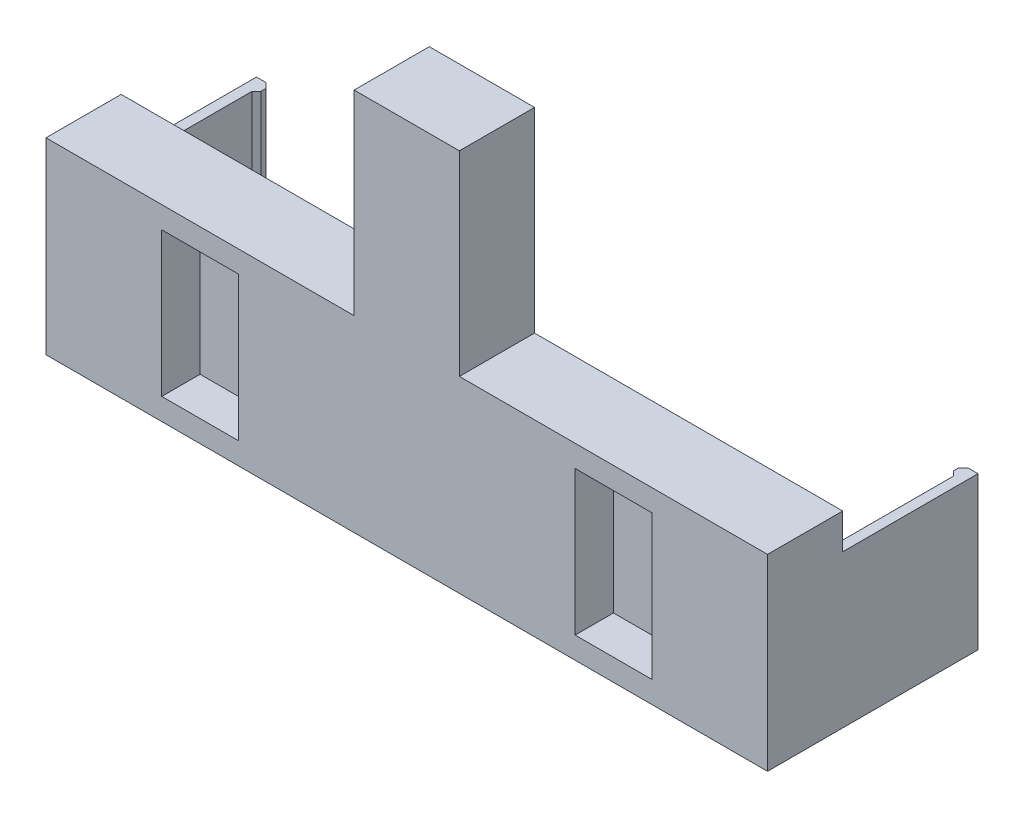
ISO-10303-21;
HEADER;
FILE_DESCRIPTION(('STEP AP214'),'2;1');
FILE_NAME('part.step','',(''),(''),'','','');
FILE_SCHEMA(('AUTOMOTIVE_DESIGN { 1 0 10303 214 1 1 1 1 }'));
ENDSEC;
DATA;
#1=APPLICATION_CONTEXT('core data for automotive mechanical design processes');
#2=APPLICATION_PROTOCOL_DEFINITION('international standard','automotive_design',2000,#1);
#3=PRODUCT_CONTEXT('',#1,'mechanical');
#4=PRODUCT('Part','Part','',(#3));
#5=PRODUCT_RELATED_PRODUCT_CATEGORY('part','',(#4));
#6=PRODUCT_DEFINITION_FORMATION('','',#4);
#7=PRODUCT_DEFINITION_CONTEXT('part definition',#1,'design');
#8=PRODUCT_DEFINITION('design','',#6,#7);
#9=PRODUCT_DEFINITION_SHAPE('','',#8);
#10=(LENGTH_UNIT() NAMED_UNIT(*) SI_UNIT(.MILLI.,.METRE.));
#11=(NAMED_UNIT(*) PLANE_ANGLE_UNIT() SI_UNIT($,.RADIAN.));
#12=(NAMED_UNIT(*) SI_UNIT($,.STERADIAN.) SOLID_ANGLE_UNIT());
#13=UNCERTAINTY_MEASURE_WITH_UNIT(LENGTH_MEASURE(1.E-05),#10,'distance_accuracy_value','');
#14=(GEOMETRIC_REPRESENTATION_CONTEXT(3) GLOBAL_UNCERTAINTY_ASSIGNED_CONTEXT((#13)) GLOBAL_UNIT_ASSIGNED_CONTEXT((#10,
#11,#12)) REPRESENTATION_CONTEXT('',''));
#15=CARTESIAN_POINT('',(0.,0.,0.));
#16=DIRECTION('',(0.,0.,1.));
#17=DIRECTION('',(1.,0.,0.));
#18=AXIS2_PLACEMENT_3D('',#15,#16,#17);
#19=CARTESIAN_POINT('',(-46.65,0.,-18.));
#20=DIRECTION('',(-1.,0.,0.));
#21=DIRECTION('',(0.,-1.,0.));
#22=AXIS2_PLACEMENT_3D('',#19,#20,#21);
#23=PLANE('',#22);
#24=DIRECTION('',(0.,0.,-1.));
#25=VECTOR('',#24,1.);
#26=CARTESIAN_POINT('',(-46.65,5.5,-18.));
#27=LINE('',#26,#25);
#28=CARTESIAN_POINT('',(-46.65,5.5,0.));
#29=VERTEX_POINT('',#28);
#30=CARTESIAN_POINT('',(-46.65,5.5,-16.062132034356));
#31=VERTEX_POINT('',#30);
#32=EDGE_CURVE('E393',#29,#31,#27,.T.);
#33=ORIENTED_EDGE('',*,*,#32,.F.);
#34=DIRECTION('',(0.,-1.,0.));
#35=VECTOR('',#34,1.);
#36=CARTESIAN_POINT('',(-46.65,0.,0.));
#37=LINE('',#36,#35);
#38=CARTESIAN_POINT('',(-46.65,-12.5,0.));
#39=VERTEX_POINT('',#38);
#40=EDGE_CURVE('E268',#29,#39,#37,.T.);
#41=ORIENTED_EDGE('',*,*,#40,.T.);
#42=DIRECTION('',(0.,0.,1.));
#43=VECTOR('',#42,1.);
#44=CARTESIAN_POINT('',(-46.65,-12.5,10.));
#45=LINE('',#44,#43);
#46=CARTESIAN_POINT('',(-46.65,-12.5,-16.062132034356));
#47=VERTEX_POINT('',#46);
#48=EDGE_CURVE('E266',#47,#39,#45,.T.);
#49=ORIENTED_EDGE('',*,*,#48,.F.);
#50=DIRECTION('',(0.,1.,0.));
#51=VECTOR('',#50,1.);
#52=CARTESIAN_POINT('',(-46.65,-14.5880613017821,-16.062132034356));
#53=LINE('',#52,#51);
#54=EDGE_CURVE('E374',#47,#31,#53,.T.);
#55=ORIENTED_EDGE('',*,*,#54,.T.);
#56=EDGE_LOOP('',(#33,#41,#49,#55));
#57=FACE_BOUND('',#56,.T.);
#58=ADVANCED_FACE('F43',(#57),#23,.F.);
#59=CARTESIAN_POINT('',(0.,12.5,10.));
#60=DIRECTION('',(0.,1.,0.));
#61=DIRECTION('',(0.,0.,1.));
#62=AXIS2_PLACEMENT_3D('',#59,#60,#61);
#63=PLANE('',#62);
#64=DIRECTION('',(1.,0.,0.));
#65=VECTOR('',#64,1.);
#66=CARTESIAN_POINT('',(0.,12.5,0.));
#67=LINE('',#66,#65);
#68=CARTESIAN_POINT('',(-48.,12.5,0.));
#69=VERTEX_POINT('',#68);
#70=CARTESIAN_POINT('',(-7.,12.5,0.));
#71=VERTEX_POINT('',#70);
#72=EDGE_CURVE('E298',#69,#71,#67,.T.);
#73=ORIENTED_EDGE('',*,*,#72,.F.);
#74=DIRECTION('',(0.,0.,-1.));
#75=VECTOR('',#74,1.);
#76=CARTESIAN_POINT('',(-48.,12.5,10.));
#77=LINE('',#76,#75);
#78=CARTESIAN_POINT('',(-48.,12.5,10.));
#79=VERTEX_POINT('',#78);
#80=EDGE_CURVE('E12',#79,#69,#77,.T.);
#81=ORIENTED_EDGE('',*,*,#80,.F.);
#82=DIRECTION('',(1.,0.,0.));
#83=VECTOR('',#82,1.);
#84=CARTESIAN_POINT('',(0.,12.5,10.));
#85=LINE('',#84,#83);
#86=CARTESIAN_POINT('',(-7.,12.5,10.));
#87=VERTEX_POINT('',#86);
#88=EDGE_CURVE('E274',#79,#87,#85,.T.);
#89=ORIENTED_EDGE('',*,*,#88,.T.);
#90=DIRECTION('',(0.,0.,-1.));
#91=VECTOR('',#90,1.);
#92=CARTESIAN_POINT('',(-7.,12.5,10.));
#93=LINE('',#92,#91);
#94=EDGE_CURVE('E297',#87,#71,#93,.T.);
#95=ORIENTED_EDGE('',*,*,#94,.T.);
#96=EDGE_LOOP('',(#73,#81,#89,#95));
#97=FACE_BOUND('',#96,.T.);
#98=ADVANCED_FACE('F477',(#97),#63,.T.);
#99=CARTESIAN_POINT('',(-48.,0.,10.));
#100=DIRECTION('',(1.,0.,0.));
#101=DIRECTION('',(0.,0.,-1.));
#102=AXIS2_PLACEMENT_3D('',#99,#100,#101);
#103=PLANE('',#102);
#104=DIRECTION('',(0.,1.,0.));
#105=VECTOR('',#104,1.);
#106=CARTESIAN_POINT('',(-48.,5.5,0.));
#107=LINE('',#106,#105);
#108=CARTESIAN_POINT('',(-48.,5.5,0.));
#109=VERTEX_POINT('',#108);
#110=EDGE_CURVE('E257',#109,#69,#107,.T.);
#111=ORIENTED_EDGE('',*,*,#110,.F.);
#112=DIRECTION('',(0.,0.,1.));
#113=VECTOR('',#112,1.);
#114=CARTESIAN_POINT('',(-48.,5.5,0.));
#115=LINE('',#114,#113);
#116=CARTESIAN_POINT('',(-48.,5.5,-18.));
#117=VERTEX_POINT('',#116);
#118=EDGE_CURVE('E242',#117,#109,#115,.T.);
#119=ORIENTED_EDGE('',*,*,#118,.F.);
#120=DIRECTION('',(0.,-1.,0.));
#121=VECTOR('',#120,1.);
#122=CARTESIAN_POINT('',(-48.,0.,-18.));
#123=LINE('',#122,#121);
#124=CARTESIAN_POINT('',(-48.,-12.5,-18.));
#125=VERTEX_POINT('',#124);
#126=EDGE_CURVE('E254',#117,#125,#123,.T.);
#127=ORIENTED_EDGE('',*,*,#126,.T.);
#128=DIRECTION('',(0.,0.,-1.));
#129=VECTOR('',#128,1.);
#130=CARTESIAN_POINT('',(-48.,-12.5,10.));
#131=LINE('',#130,#129);
#132=CARTESIAN_POINT('',(-48.,-12.5,10.));
#133=VERTEX_POINT('',#132);
#134=EDGE_CURVE('E53',#133,#125,#131,.T.);
#135=ORIENTED_EDGE('',*,*,#134,.F.);
#136=DIRECTION('',(0.,-1.,0.));
#137=VECTOR('',#136,1.);
#138=CARTESIAN_POINT('',(-48.,0.,10.));
#139=LINE('',#138,#137);
#140=EDGE_CURVE('E277',#79,#133,#139,.T.);
#141=ORIENTED_EDGE('',*,*,#140,.F.);
#142=ORIENTED_EDGE('',*,*,#80,.T.);
#143=EDGE_LOOP('',(#111,#119,#127,#135,#141,#142));
#144=FACE_BOUND('',#143,.T.);
#145=ADVANCED_FACE('F252',(#144),#103,.F.);
#146=CARTESIAN_POINT('',(0.,0.,-18.));
#147=DIRECTION('',(0.,0.,1.));
#148=DIRECTION('',(1.,0.,0.));
#149=AXIS2_PLACEMENT_3D('',#146,#147,#148);
#150=PLANE('',#149);
#151=DIRECTION('',(-1.,0.,0.));
#152=VECTOR('',#151,1.);
#153=CARTESIAN_POINT('',(0.,5.5,-18.));
#154=LINE('',#153,#152);
#155=CARTESIAN_POINT('',(-46.712132034356,5.5,-18.));
#156=VERTEX_POINT('',#155);
#157=EDGE_CURVE('E239',#156,#117,#154,.T.);
#158=ORIENTED_EDGE('',*,*,#157,.F.);
#159=DIRECTION('',(0.,-1.,0.));
#160=VECTOR('',#159,1.);
#161=CARTESIAN_POINT('',(-46.712132034356,0.,-18.));
#162=LINE('',#161,#160);
#163=CARTESIAN_POINT('',(-46.712132034356,-12.5,-18.));
#164=VERTEX_POINT('',#163);
#165=EDGE_CURVE('E264',#156,#164,#162,.T.);
#166=ORIENTED_EDGE('',*,*,#165,.T.);
#167=DIRECTION('',(1.,0.,0.));
#168=VECTOR('',#167,1.);
#169=CARTESIAN_POINT('',(0.,-12.5,-18.));
#170=LINE('',#169,#168);
#171=EDGE_CURVE('E263',#125,#164,#170,.T.);
#172=ORIENTED_EDGE('',*,*,#171,.F.);
#173=ORIENTED_EDGE('',*,*,#126,.F.);
#174=EDGE_LOOP('',(#158,#166,#172,#173));
#175=FACE_BOUND('',#174,.T.);
#176=ADVANCED_FACE('F261',(#175),#150,.F.);
#177=CARTESIAN_POINT('',(-14.356066017178,-14.5880613017821,14.356066017178));
#178=DIRECTION('',(-0.707106781186547,0.,0.707106781186547));
#179=DIRECTION('',(0.707106781186548,0.,0.707106781186548));
#180=AXIS2_PLACEMENT_3D('',#177,#178,#179);
#181=PLANE('',#180);
#182=DIRECTION('',(-0.707106781186548,0.,-0.707106781186548));
#183=VECTOR('',#182,1.);
#184=CARTESIAN_POINT('',(-14.356066017178,5.5,14.356066017178));
#185=LINE('',#184,#183);
#186=CARTESIAN_POINT('',(-46.05,5.5,-17.337867965644));
#187=VERTEX_POINT('',#186);
#188=EDGE_CURVE('E245',#187,#156,#185,.T.);
#189=ORIENTED_EDGE('',*,*,#188,.F.);
#190=DIRECTION('',(0.,1.,0.));
#191=VECTOR('',#190,1.);
#192=CARTESIAN_POINT('',(-46.05,-14.5880613017821,-17.337867965644));
#193=LINE('',#192,#191);
#194=CARTESIAN_POINT('',(-46.05,-12.5,-17.337867965644));
#195=VERTEX_POINT('',#194);
#196=EDGE_CURVE('E371',#195,#187,#193,.T.);
#197=ORIENTED_EDGE('',*,*,#196,.F.);
#198=DIRECTION('',(-0.707106781186548,0.,-0.707106781186548));
#199=VECTOR('',#198,1.);
#200=CARTESIAN_POINT('',(-14.356066017178,-12.5,14.356066017178));
#201=LINE('',#200,#199);
#202=EDGE_CURVE('E378',#195,#164,#201,.T.);
#203=ORIENTED_EDGE('',*,*,#202,.T.);
#204=ORIENTED_EDGE('',*,*,#165,.F.);
#205=EDGE_LOOP('',(#189,#197,#203,#204));
#206=FACE_BOUND('',#205,.T.);
#207=ADVANCED_FACE('F643',(#206),#181,.F.);
#208=CARTESIAN_POINT('',(-31.3560660171779,-14.5880613017821,-31.356066017178));
#209=DIRECTION('',(-0.707106781186546,0.,-0.707106781186549));
#210=DIRECTION('',(-0.707106781186549,0.,0.707106781186546));
#211=AXIS2_PLACEMENT_3D('',#208,#209,#210);
#212=PLANE('',#211);
#213=DIRECTION('',(0.707106781186549,0.,-0.707106781186546));
#214=VECTOR('',#213,1.);
#215=CARTESIAN_POINT('',(-31.3560660171779,5.5,-31.356066017178));
#216=LINE('',#215,#214);
#217=CARTESIAN_POINT('',(-46.05,5.5,-16.662132034356));
#218=VERTEX_POINT('',#217);
#219=EDGE_CURVE('E395',#31,#218,#216,.T.);
#220=ORIENTED_EDGE('',*,*,#219,.F.);
#221=ORIENTED_EDGE('',*,*,#54,.F.);
#222=DIRECTION('',(0.707106781186549,0.,-0.707106781186546));
#223=VECTOR('',#222,1.);
#224=CARTESIAN_POINT('',(-31.3560660171779,-12.5,-31.356066017178));
#225=LINE('',#224,#223);
#226=CARTESIAN_POINT('',(-46.05,-12.5,-16.662132034356));
#227=VERTEX_POINT('',#226);
#228=EDGE_CURVE('E385',#47,#227,#225,.T.);
#229=ORIENTED_EDGE('',*,*,#228,.T.);
#230=DIRECTION('',(0.,1.,0.));
#231=VECTOR('',#230,1.);
#232=CARTESIAN_POINT('',(-46.05,-14.5880613017821,-16.662132034356));
#233=LINE('',#232,#231);
#234=EDGE_CURVE('E375',#227,#218,#233,.T.);
#235=ORIENTED_EDGE('',*,*,#234,.T.);
#236=EDGE_LOOP('',(#220,#221,#229,#235));
#237=FACE_BOUND('',#236,.T.);
#238=ADVANCED_FACE('F490',(#237),#212,.F.);
#239=CARTESIAN_POINT('',(-46.05,-14.5880613017821,0.));
#240=DIRECTION('',(-1.,0.,0.));
#241=DIRECTION('',(0.,0.,1.));
#242=AXIS2_PLACEMENT_3D('',#239,#240,#241);
#243=PLANE('',#242);
#244=DIRECTION('',(0.,0.,-1.));
#245=VECTOR('',#244,1.);
#246=CARTESIAN_POINT('',(-46.05,5.5,0.));
#247=LINE('',#246,#245);
#248=EDGE_CURVE('E381',#218,#187,#247,.T.);
#249=ORIENTED_EDGE('',*,*,#248,.F.);
#250=ORIENTED_EDGE('',*,*,#234,.F.);
#251=DIRECTION('',(0.,0.,-1.));
#252=VECTOR('',#251,1.);
#253=CARTESIAN_POINT('',(-46.05,-12.5,0.));
#254=LINE('',#253,#252);
#255=EDGE_CURVE('E346',#227,#195,#254,.T.);
#256=ORIENTED_EDGE('',*,*,#255,.T.);
#257=ORIENTED_EDGE('',*,*,#196,.T.);
#258=EDGE_LOOP('',(#249,#250,#256,#257));
#259=FACE_BOUND('',#258,.T.);
#260=ADVANCED_FACE('F509',(#259),#243,.F.);
#261=CARTESIAN_POINT('',(46.65,0.,-18.));
#262=DIRECTION('',(-1.,0.,0.));
#263=DIRECTION('',(0.,-1.,0.));
#264=AXIS2_PLACEMENT_3D('',#261,#262,#263);
#265=PLANE('',#264);
#266=DIRECTION('',(0.,-1.,0.));
#267=VECTOR('',#266,1.);
#268=CARTESIAN_POINT('',(46.65,0.,0.));
#269=LINE('',#268,#267);
#270=CARTESIAN_POINT('',(46.65,7.8,0.));
#271=VERTEX_POINT('',#270);
#272=CARTESIAN_POINT('',(46.65,-12.5,0.));
#273=VERTEX_POINT('',#272);
#274=EDGE_CURVE('E359',#271,#273,#269,.T.);
#275=ORIENTED_EDGE('',*,*,#274,.F.);
#276=DIRECTION('',(0.,0.,1.));
#277=VECTOR('',#276,1.);
#278=CARTESIAN_POINT('',(46.65,7.8,0.));
#279=LINE('',#278,#277);
#280=CARTESIAN_POINT('',(46.65,7.8,-16.062132034356));
#281=VERTEX_POINT('',#280);
#282=EDGE_CURVE('E355',#281,#271,#279,.T.);
#283=ORIENTED_EDGE('',*,*,#282,.F.);
#284=DIRECTION('',(0.,1.,0.));
#285=VECTOR('',#284,1.);
#286=CARTESIAN_POINT('',(46.65,0.,-16.062132034356));
#287=LINE('',#286,#285);
#288=CARTESIAN_POINT('',(46.65,-12.5,-16.062132034356));
#289=VERTEX_POINT('',#288);
#290=EDGE_CURVE('E340',#289,#281,#287,.T.);
#291=ORIENTED_EDGE('',*,*,#290,.F.);
#292=DIRECTION('',(0.,0.,1.));
#293=VECTOR('',#292,1.);
#294=CARTESIAN_POINT('',(46.65,-12.5,10.));
#295=LINE('',#294,#293);
#296=EDGE_CURVE('E301',#289,#273,#295,.T.);
#297=ORIENTED_EDGE('',*,*,#296,.T.);
#298=EDGE_LOOP('',(#275,#283,#291,#297));
#299=FACE_BOUND('',#298,.T.);
#300=ADVANCED_FACE('F506',(#299),#265,.T.);
#301=CARTESIAN_POINT('',(0.,0.,-18.));
#302=DIRECTION('',(0.,0.,1.));
#303=DIRECTION('',(1.,0.,0.));
#304=AXIS2_PLACEMENT_3D('',#301,#302,#303);
#305=PLANE('',#304);
#306=DIRECTION('',(-1.,0.,0.));
#307=VECTOR('',#306,1.);
#308=CARTESIAN_POINT('',(0.,7.8,-18.));
#309=LINE('',#308,#307);
#310=CARTESIAN_POINT('',(48.,7.8,-18.));
#311=VERTEX_POINT('',#310);
#312=CARTESIAN_POINT('',(46.712132034356,7.8,-18.));
#313=VERTEX_POINT('',#312);
#314=EDGE_CURVE('E350',#311,#313,#309,.T.);
#315=ORIENTED_EDGE('',*,*,#314,.F.);
#316=DIRECTION('',(0.,-1.,0.));
#317=VECTOR('',#316,1.);
#318=CARTESIAN_POINT('',(48.,0.,-18.));
#319=LINE('',#318,#317);
#320=CARTESIAN_POINT('',(48.,-12.5,-18.));
#321=VERTEX_POINT('',#320);
#322=EDGE_CURVE('E271',#311,#321,#319,.T.);
#323=ORIENTED_EDGE('',*,*,#322,.T.);
#324=DIRECTION('',(1.,0.,0.));
#325=VECTOR('',#324,1.);
#326=CARTESIAN_POINT('',(0.,-12.5,-18.));
#327=LINE('',#326,#325);
#328=CARTESIAN_POINT('',(46.712132034356,-12.5,-18.));
#329=VERTEX_POINT('',#328);
#330=EDGE_CURVE('E370',#329,#321,#327,.T.);
#331=ORIENTED_EDGE('',*,*,#330,.F.);
#332=DIRECTION('',(0.,-1.,0.));
#333=VECTOR('',#332,1.);
#334=CARTESIAN_POINT('',(46.712132034356,0.,-18.));
#335=LINE('',#334,#333);
#336=EDGE_CURVE('E361',#313,#329,#335,.T.);
#337=ORIENTED_EDGE('',*,*,#336,.F.);
#338=EDGE_LOOP('',(#315,#323,#331,#337));
#339=FACE_BOUND('',#338,.T.);
#340=ADVANCED_FACE('F504',(#339),#305,.F.);
#341=CARTESIAN_POINT('',(31.3560660171779,-14.5880613017821,-31.356066017178));
#342=DIRECTION('',(-0.707106781186546,0.,0.707106781186549));
#343=DIRECTION('',(0.707106781186549,0.,0.707106781186546));
#344=AXIS2_PLACEMENT_3D('',#341,#342,#343);
#345=PLANE('',#344);
#346=ORIENTED_EDGE('',*,*,#290,.T.);
#347=DIRECTION('',(0.707106781186549,0.,0.707106781186546));
#348=VECTOR('',#347,1.);
#349=CARTESIAN_POINT('',(31.3560660171779,7.8,-31.356066017178));
#350=LINE('',#349,#348);
#351=CARTESIAN_POINT('',(46.05,7.8,-16.662132034356));
#352=VERTEX_POINT('',#351);
#353=EDGE_CURVE('E352',#352,#281,#350,.T.);
#354=ORIENTED_EDGE('',*,*,#353,.F.);
#355=DIRECTION('',(0.,1.,0.));
#356=VECTOR('',#355,1.);
#357=CARTESIAN_POINT('',(46.05,-14.5880613017821,-16.662132034356));
#358=LINE('',#357,#356);
#359=CARTESIAN_POINT('',(46.05,-12.5,-16.662132034356));
#360=VERTEX_POINT('',#359);
#361=EDGE_CURVE('E339',#360,#352,#358,.T.);
#362=ORIENTED_EDGE('',*,*,#361,.F.);
#363=DIRECTION('',(-0.707106781186549,0.,-0.707106781186546));
#364=VECTOR('',#363,1.);
#365=CARTESIAN_POINT('',(31.3560660171779,-12.5,-31.356066017178));
#366=LINE('',#365,#364);
#367=EDGE_CURVE('E335',#289,#360,#366,.T.);
#368=ORIENTED_EDGE('',*,*,#367,.F.);
#369=EDGE_LOOP('',(#346,#354,#362,#368));
#370=FACE_BOUND('',#369,.T.);
#371=ADVANCED_FACE('F500',(#370),#345,.T.);
#372=CARTESIAN_POINT('',(46.05,-14.5880613017821,0.));
#373=DIRECTION('',(-1.,0.,0.));
#374=DIRECTION('',(0.,0.,1.));
#375=AXIS2_PLACEMENT_3D('',#372,#373,#374);
#376=PLANE('',#375);
#377=ORIENTED_EDGE('',*,*,#361,.T.);
#378=DIRECTION('',(0.,0.,1.));
#379=VECTOR('',#378,1.);
#380=CARTESIAN_POINT('',(46.05,7.8,0.));
#381=LINE('',#380,#379);
#382=CARTESIAN_POINT('',(46.05,7.8,-17.337867965644));
#383=VERTEX_POINT('',#382);
#384=EDGE_CURVE('E349',#383,#352,#381,.T.);
#385=ORIENTED_EDGE('',*,*,#384,.F.);
#386=DIRECTION('',(0.,1.,0.));
#387=VECTOR('',#386,1.);
#388=CARTESIAN_POINT('',(46.05,-14.5880613017821,-17.337867965644));
#389=LINE('',#388,#387);
#390=CARTESIAN_POINT('',(46.05,-12.5,-17.337867965644));
#391=VERTEX_POINT('',#390);
#392=EDGE_CURVE('E336',#391,#383,#389,.T.);
#393=ORIENTED_EDGE('',*,*,#392,.F.);
#394=DIRECTION('',(0.,0.,-1.));
#395=VECTOR('',#394,1.);
#396=CARTESIAN_POINT('',(46.05,-12.5,0.));
#397=LINE('',#396,#395);
#398=EDGE_CURVE('E365',#360,#391,#397,.T.);
#399=ORIENTED_EDGE('',*,*,#398,.F.);
#400=EDGE_LOOP('',(#377,#385,#393,#399));
#401=FACE_BOUND('',#400,.T.);
#402=ADVANCED_FACE('F496',(#401),#376,.T.);
#403=CARTESIAN_POINT('',(14.356066017178,-14.5880613017821,14.356066017178));
#404=DIRECTION('',(-0.707106781186547,0.,-0.707106781186547));
#405=DIRECTION('',(-0.707106781186548,0.,0.707106781186548));
#406=AXIS2_PLACEMENT_3D('',#403,#404,#405);
#407=PLANE('',#406);
#408=ORIENTED_EDGE('',*,*,#392,.T.);
#409=DIRECTION('',(-0.707106781186548,0.,0.707106781186548));
#410=VECTOR('',#409,1.);
#411=CARTESIAN_POINT('',(14.356066017178,7.8,14.356066017178));
#412=LINE('',#411,#410);
#413=EDGE_CURVE('E347',#313,#383,#412,.T.);
#414=ORIENTED_EDGE('',*,*,#413,.F.);
#415=ORIENTED_EDGE('',*,*,#336,.T.);
#416=DIRECTION('',(0.707106781186548,0.,-0.707106781186548));
#417=VECTOR('',#416,1.);
#418=CARTESIAN_POINT('',(14.356066017178,-12.5,14.356066017178));
#419=LINE('',#418,#417);
#420=EDGE_CURVE('E343',#391,#329,#419,.T.);
#421=ORIENTED_EDGE('',*,*,#420,.F.);
#422=EDGE_LOOP('',(#408,#414,#415,#421));
#423=FACE_BOUND('',#422,.T.);
#424=ADVANCED_FACE('F492',(#423),#407,.T.);
#425=CARTESIAN_POINT('',(0.,0.,0.));
#426=DIRECTION('',(0.,0.,1.));
#427=DIRECTION('',(1.,0.,0.));
#428=AXIS2_PLACEMENT_3D('',#425,#426,#427);
#429=PLANE('',#428);
#430=CARTESIAN_POINT('',(0.,31.5,0.));
#431=DIRECTION('',(0.,0.,1.));
#432=DIRECTION('',(1.,0.,0.));
#433=AXIS2_PLACEMENT_3D('',#430,#431,#432);
#434=CIRCLE('',#433,1.85);
#435=CARTESIAN_POINT('',(1.85,31.5,0.));
#436=VERTEX_POINT('',#435);
#437=EDGE_CURVE('E332',#436,#436,#434,.T.);
#438=ORIENTED_EDGE('',*,*,#437,.T.);
#439=EDGE_LOOP('',(#438));
#440=FACE_BOUND('',#439,.T.);
#441=DIRECTION('',(1.,0.,0.));
#442=VECTOR('',#441,1.);
#443=CARTESIAN_POINT('',(0.,12.5,0.));
#444=LINE('',#443,#442);
#445=CARTESIAN_POINT('',(7.,12.5,0.));
#446=VERTEX_POINT('',#445);
#447=CARTESIAN_POINT('',(48.,12.5,0.));
#448=VERTEX_POINT('',#447);
#449=EDGE_CURVE('E304',#446,#448,#444,.T.);
#450=ORIENTED_EDGE('',*,*,#449,.T.);
#451=DIRECTION('',(0.,1.,0.));
#452=VECTOR('',#451,1.);
#453=CARTESIAN_POINT('',(48.,7.8,0.));
#454=LINE('',#453,#452);
#455=CARTESIAN_POINT('',(48.,7.8,0.));
#456=VERTEX_POINT('',#455);
#457=EDGE_CURVE('E354',#456,#448,#454,.T.);
#458=ORIENTED_EDGE('',*,*,#457,.F.);
#459=DIRECTION('',(1.,0.,0.));
#460=VECTOR('',#459,1.);
#461=CARTESIAN_POINT('',(0.,7.8,0.));
#462=LINE('',#461,#460);
#463=EDGE_CURVE('E358',#271,#456,#462,.T.);
#464=ORIENTED_EDGE('',*,*,#463,.F.);
#465=ORIENTED_EDGE('',*,*,#274,.T.);
#466=DIRECTION('',(1.,0.,0.));
#467=VECTOR('',#466,1.);
#468=CARTESIAN_POINT('',(0.,-12.5,0.));
#469=LINE('',#468,#467);
#470=EDGE_CURVE('E300',#39,#273,#469,.T.);
#471=ORIENTED_EDGE('',*,*,#470,.F.);
#472=ORIENTED_EDGE('',*,*,#40,.F.);
#473=DIRECTION('',(-1.,0.,0.));
#474=VECTOR('',#473,1.);
#475=CARTESIAN_POINT('',(0.,5.5,1.07552855510563E-13));
#476=LINE('',#475,#474);
#477=EDGE_CURVE('E258',#29,#109,#476,.T.);
#478=ORIENTED_EDGE('',*,*,#477,.T.);
#479=ORIENTED_EDGE('',*,*,#110,.T.);
#480=ORIENTED_EDGE('',*,*,#72,.T.);
#481=DIRECTION('',(0.,1.,0.));
#482=VECTOR('',#481,1.);
#483=CARTESIAN_POINT('',(-7.,0.,0.));
#484=LINE('',#483,#482);
#485=CARTESIAN_POINT('',(-7.,38.5,0.));
#486=VERTEX_POINT('',#485);
#487=EDGE_CURVE('E278',#71,#486,#484,.T.);
#488=ORIENTED_EDGE('',*,*,#487,.T.);
#489=DIRECTION('',(1.,0.,0.));
#490=VECTOR('',#489,1.);
#491=CARTESIAN_POINT('',(0.,38.5,0.));
#492=LINE('',#491,#490);
#493=CARTESIAN_POINT('',(7.,38.5,0.));
#494=VERTEX_POINT('',#493);
#495=EDGE_CURVE('E309',#486,#494,#492,.T.);
#496=ORIENTED_EDGE('',*,*,#495,.T.);
#497=DIRECTION('',(0.,-1.,0.));
#498=VECTOR('',#497,1.);
#499=CARTESIAN_POINT('',(7.,0.,0.));
#500=LINE('',#499,#498);
#501=EDGE_CURVE('E306',#494,#446,#500,.T.);
#502=ORIENTED_EDGE('',*,*,#501,.T.);
#503=EDGE_LOOP('',(#450,#458,#464,#465,#471,#472,#478,#479,#480,#488,#496,#502));
#504=FACE_BOUND('',#503,.T.);
#505=ADVANCED_FACE('F495',(#440,#504),#429,.F.);
#506=CARTESIAN_POINT('',(0.,-12.5,10.));
#507=DIRECTION('',(0.,1.,0.));
#508=DIRECTION('',(0.,0.,1.));
#509=AXIS2_PLACEMENT_3D('',#506,#507,#508);
#510=PLANE('',#509);
#511=ORIENTED_EDGE('',*,*,#134,.T.);
#512=ORIENTED_EDGE('',*,*,#171,.T.);
#513=ORIENTED_EDGE('',*,*,#202,.F.);
#514=ORIENTED_EDGE('',*,*,#255,.F.);
#515=ORIENTED_EDGE('',*,*,#228,.F.);
#516=ORIENTED_EDGE('',*,*,#48,.T.);
#517=ORIENTED_EDGE('',*,*,#470,.T.);
#518=ORIENTED_EDGE('',*,*,#296,.F.);
#519=ORIENTED_EDGE('',*,*,#367,.T.);
#520=ORIENTED_EDGE('',*,*,#398,.T.);
#521=ORIENTED_EDGE('',*,*,#420,.T.);
#522=ORIENTED_EDGE('',*,*,#330,.T.);
#523=DIRECTION('',(0.,0.,-1.));
#524=VECTOR('',#523,1.);
#525=CARTESIAN_POINT('',(48.,-12.5,10.));
#526=LINE('',#525,#524);
#527=CARTESIAN_POINT('',(48.,-12.5,10.));
#528=VERTEX_POINT('',#527);
#529=EDGE_CURVE('E325',#528,#321,#526,.T.);
#530=ORIENTED_EDGE('',*,*,#529,.F.);
#531=DIRECTION('',(1.,0.,0.));
#532=VECTOR('',#531,1.);
#533=CARTESIAN_POINT('',(0.,-12.5,10.));
#534=LINE('',#533,#532);
#535=EDGE_CURVE('E280',#133,#528,#534,.T.);
#536=ORIENTED_EDGE('',*,*,#535,.F.);
#537=EDGE_LOOP('',(#511,#512,#513,#514,#515,#516,#517,#518,#519,#520,#521,#522,#530,#536));
#538=FACE_BOUND('',#537,.T.);
#539=ADVANCED_FACE('F607',(#538),#510,.F.);
#540=CARTESIAN_POINT('',(48.,0.,10.));
#541=DIRECTION('',(1.,0.,0.));
#542=DIRECTION('',(0.,0.,-1.));
#543=AXIS2_PLACEMENT_3D('',#540,#541,#542);
#544=PLANE('',#543);
#545=ORIENTED_EDGE('',*,*,#457,.T.);
#546=DIRECTION('',(0.,0.,-1.));
#547=VECTOR('',#546,1.);
#548=CARTESIAN_POINT('',(48.,12.5,10.));
#549=LINE('',#548,#547);
#550=CARTESIAN_POINT('',(48.,12.5,10.));
#551=VERTEX_POINT('',#550);
#552=EDGE_CURVE('E322',#551,#448,#549,.T.);
#553=ORIENTED_EDGE('',*,*,#552,.F.);
#554=DIRECTION('',(0.,-1.,0.));
#555=VECTOR('',#554,1.);
#556=CARTESIAN_POINT('',(48.,0.,10.));
#557=LINE('',#556,#555);
#558=EDGE_CURVE('E282',#551,#528,#557,.T.);
#559=ORIENTED_EDGE('',*,*,#558,.T.);
#560=ORIENTED_EDGE('',*,*,#529,.T.);
#561=ORIENTED_EDGE('',*,*,#322,.F.);
#562=DIRECTION('',(0.,0.,-1.));
#563=VECTOR('',#562,1.);
#564=CARTESIAN_POINT('',(48.,7.8,0.));
#565=LINE('',#564,#563);
#566=EDGE_CURVE('E835',#456,#311,#565,.T.);
#567=ORIENTED_EDGE('',*,*,#566,.F.);
#568=EDGE_LOOP('',(#545,#553,#559,#560,#561,#567));
#569=FACE_BOUND('',#568,.T.);
#570=ADVANCED_FACE('F776',(#569),#544,.T.);
#571=CARTESIAN_POINT('',(0.,12.5,10.));
#572=DIRECTION('',(0.,1.,0.));
#573=DIRECTION('',(0.,0.,1.));
#574=AXIS2_PLACEMENT_3D('',#571,#572,#573);
#575=PLANE('',#574);
#576=ORIENTED_EDGE('',*,*,#552,.T.);
#577=ORIENTED_EDGE('',*,*,#449,.F.);
#578=DIRECTION('',(0.,0.,-1.));
#579=VECTOR('',#578,1.);
#580=CARTESIAN_POINT('',(7.,12.5,10.));
#581=LINE('',#580,#579);
#582=CARTESIAN_POINT('',(7.,12.5,10.));
#583=VERTEX_POINT('',#582);
#584=EDGE_CURVE('E320',#583,#446,#581,.T.);
#585=ORIENTED_EDGE('',*,*,#584,.F.);
#586=DIRECTION('',(1.,0.,0.));
#587=VECTOR('',#586,1.);
#588=CARTESIAN_POINT('',(0.,12.5,10.));
#589=LINE('',#588,#587);
#590=EDGE_CURVE('E285',#583,#551,#589,.T.);
#591=ORIENTED_EDGE('',*,*,#590,.T.);
#592=EDGE_LOOP('',(#576,#577,#585,#591));
#593=FACE_BOUND('',#592,.T.);
#594=ADVANCED_FACE('F768',(#593),#575,.T.);
#595=CARTESIAN_POINT('',(7.,0.,10.));
#596=DIRECTION('',(1.,0.,0.));
#597=DIRECTION('',(0.,1.,0.));
#598=AXIS2_PLACEMENT_3D('',#595,#596,#597);
#599=PLANE('',#598);
#600=ORIENTED_EDGE('',*,*,#501,.F.);
#601=DIRECTION('',(0.,0.,-1.));
#602=VECTOR('',#601,1.);
#603=CARTESIAN_POINT('',(7.,38.5,10.));
#604=LINE('',#603,#602);
#605=CARTESIAN_POINT('',(7.,38.5,10.));
#606=VERTEX_POINT('',#605);
#607=EDGE_CURVE('E318',#606,#494,#604,.T.);
#608=ORIENTED_EDGE('',*,*,#607,.F.);
#609=DIRECTION('',(0.,-1.,0.));
#610=VECTOR('',#609,1.);
#611=CARTESIAN_POINT('',(7.,0.,10.));
#612=LINE('',#611,#610);
#613=EDGE_CURVE('E288',#606,#583,#612,.T.);
#614=ORIENTED_EDGE('',*,*,#613,.T.);
#615=ORIENTED_EDGE('',*,*,#584,.T.);
#616=EDGE_LOOP('',(#600,#608,#614,#615));
#617=FACE_BOUND('',#616,.T.);
#618=ADVANCED_FACE('F759',(#617),#599,.T.);
#619=CARTESIAN_POINT('',(0.,38.5,10.));
#620=DIRECTION('',(0.,1.,0.));
#621=DIRECTION('',(0.,0.,1.));
#622=AXIS2_PLACEMENT_3D('',#619,#620,#621);
#623=PLANE('',#622);
#624=ORIENTED_EDGE('',*,*,#495,.F.);
#625=DIRECTION('',(0.,0.,-1.));
#626=VECTOR('',#625,1.);
#627=CARTESIAN_POINT('',(-7.,38.5,10.));
#628=LINE('',#627,#626);
#629=CARTESIAN_POINT('',(-7.,38.5,10.));
#630=VERTEX_POINT('',#629);
#631=EDGE_CURVE('E316',#630,#486,#628,.T.);
#632=ORIENTED_EDGE('',*,*,#631,.F.);
#633=DIRECTION('',(1.,0.,0.));
#634=VECTOR('',#633,1.);
#635=CARTESIAN_POINT('',(0.,38.5,10.));
#636=LINE('',#635,#634);
#637=EDGE_CURVE('E291',#630,#606,#636,.T.);
#638=ORIENTED_EDGE('',*,*,#637,.T.);
#639=ORIENTED_EDGE('',*,*,#607,.T.);
#640=EDGE_LOOP('',(#624,#632,#638,#639));
#641=FACE_BOUND('',#640,.T.);
#642=ADVANCED_FACE('F750',(#641),#623,.T.);
#643=CARTESIAN_POINT('',(-7.,0.,10.));
#644=DIRECTION('',(-1.,0.,0.));
#645=DIRECTION('',(0.,-1.,0.));
#646=AXIS2_PLACEMENT_3D('',#643,#644,#645);
#647=PLANE('',#646);
#648=ORIENTED_EDGE('',*,*,#487,.F.);
#649=ORIENTED_EDGE('',*,*,#94,.F.);
#650=DIRECTION('',(0.,1.,0.));
#651=VECTOR('',#650,1.);
#652=CARTESIAN_POINT('',(-7.,0.,10.));
#653=LINE('',#652,#651);
#654=EDGE_CURVE('E294',#87,#630,#653,.T.);
#655=ORIENTED_EDGE('',*,*,#654,.T.);
#656=ORIENTED_EDGE('',*,*,#631,.T.);
#657=EDGE_LOOP('',(#648,#649,#655,#656));
#658=FACE_BOUND('',#657,.T.);
#659=ADVANCED_FACE('F741',(#658),#647,.T.);
#660=CARTESIAN_POINT('',(0.,0.,10.));
#661=DIRECTION('',(0.,0.,1.));
#662=DIRECTION('',(1.,0.,0.));
#663=AXIS2_PLACEMENT_3D('',#660,#661,#662);
#664=PLANE('',#663);
#665=DIRECTION('',(0.,1.,0.));
#666=VECTOR('',#665,1.);
#667=CARTESIAN_POINT('',(-22.4,0.,10.));
#668=LINE('',#667,#666);
#669=CARTESIAN_POINT('',(-22.4,-9.6,10.));
#670=VERTEX_POINT('',#669);
#671=CARTESIAN_POINT('',(-22.4,9.6,10.));
#672=VERTEX_POINT('',#671);
#673=EDGE_CURVE('E62',#670,#672,#668,.T.);
#674=ORIENTED_EDGE('',*,*,#673,.F.);
#675=DIRECTION('',(1.,0.,0.));
#676=VECTOR('',#675,1.);
#677=CARTESIAN_POINT('',(0.,-9.6,10.));
#678=LINE('',#677,#676);
#679=CARTESIAN_POINT('',(-32.6,-9.6,10.));
#680=VERTEX_POINT('',#679);
#681=EDGE_CURVE('E405',#680,#670,#678,.T.);
#682=ORIENTED_EDGE('',*,*,#681,.F.);
#683=DIRECTION('',(0.,-1.,0.));
#684=VECTOR('',#683,1.);
#685=CARTESIAN_POINT('',(-32.6,0.,10.));
#686=LINE('',#685,#684);
#687=CARTESIAN_POINT('',(-32.6,9.6,10.));
#688=VERTEX_POINT('',#687);
#689=EDGE_CURVE('E419',#688,#680,#686,.T.);
#690=ORIENTED_EDGE('',*,*,#689,.F.);
#691=DIRECTION('',(-1.,0.,0.));
#692=VECTOR('',#691,1.);
#693=CARTESIAN_POINT('',(0.,9.6,10.));
#694=LINE('',#693,#692);
#695=EDGE_CURVE('E417',#672,#688,#694,.T.);
#696=ORIENTED_EDGE('',*,*,#695,.F.);
#697=EDGE_LOOP('',(#674,#682,#690,#696));
#698=FACE_BOUND('',#697,.T.);
#699=DIRECTION('',(0.,1.,0.));
#700=VECTOR('',#699,1.);
#701=CARTESIAN_POINT('',(32.6,0.,10.));
#702=LINE('',#701,#700);
#703=CARTESIAN_POINT('',(32.6,-9.59999999999999,10.));
#704=VERTEX_POINT('',#703);
#705=CARTESIAN_POINT('',(32.6,9.60000000000001,10.));
#706=VERTEX_POINT('',#705);
#707=EDGE_CURVE('E47',#704,#706,#702,.T.);
#708=ORIENTED_EDGE('',*,*,#707,.F.);
#709=DIRECTION('',(1.,0.,0.));
#710=VECTOR('',#709,1.);
#711=CARTESIAN_POINT('',(0.,-9.59999999999999,10.));
#712=LINE('',#711,#710);
#713=CARTESIAN_POINT('',(22.4,-9.59999999999999,10.));
#714=VERTEX_POINT('',#713);
#715=EDGE_CURVE('E443',#714,#704,#712,.T.);
#716=ORIENTED_EDGE('',*,*,#715,.F.);
#717=DIRECTION('',(0.,-1.,0.));
#718=VECTOR('',#717,1.);
#719=CARTESIAN_POINT('',(22.4,0.,10.));
#720=LINE('',#719,#718);
#721=CARTESIAN_POINT('',(22.4,9.60000000000001,10.));
#722=VERTEX_POINT('',#721);
#723=EDGE_CURVE('E446',#722,#714,#720,.T.);
#724=ORIENTED_EDGE('',*,*,#723,.F.);
#725=DIRECTION('',(-1.,0.,0.));
#726=VECTOR('',#725,1.);
#727=CARTESIAN_POINT('',(0.,9.60000000000001,10.));
#728=LINE('',#727,#726);
#729=EDGE_CURVE('E447',#706,#722,#728,.T.);
#730=ORIENTED_EDGE('',*,*,#729,.F.);
#731=EDGE_LOOP('',(#708,#716,#724,#730));
#732=FACE_BOUND('',#731,.T.);
#733=ORIENTED_EDGE('',*,*,#88,.F.);
#734=ORIENTED_EDGE('',*,*,#140,.T.);
#735=ORIENTED_EDGE('',*,*,#535,.T.);
#736=ORIENTED_EDGE('',*,*,#558,.F.);
#737=ORIENTED_EDGE('',*,*,#590,.F.);
#738=ORIENTED_EDGE('',*,*,#613,.F.);
#739=ORIENTED_EDGE('',*,*,#637,.F.);
#740=ORIENTED_EDGE('',*,*,#654,.F.);
#741=EDGE_LOOP('',(#733,#734,#735,#736,#737,#738,#739,#740));
#742=FACE_BOUND('',#741,.T.);
#743=ADVANCED_FACE('F459',(#698,#732,#742),#664,.T.);
#744=CARTESIAN_POINT('',(0.,31.5,-5.));
#745=DIRECTION('',(0.,0.,1.));
#746=DIRECTION('',(1.,0.,0.));
#747=AXIS2_PLACEMENT_3D('',#744,#745,#746);
#748=CYLINDRICAL_SURFACE('',#747,1.85);
#749=CARTESIAN_POINT('',(0.,31.5,-4.85));
#750=DIRECTION('',(0.,0.,1.));
#751=DIRECTION('',(1.,0.,0.));
#752=AXIS2_PLACEMENT_3D('',#749,#750,#751);
#753=CIRCLE('',#752,1.85);
#754=CARTESIAN_POINT('',(1.85,31.5,-4.85));
#755=VERTEX_POINT('',#754);
#756=EDGE_CURVE('E329',#755,#755,#753,.T.);
#757=ORIENTED_EDGE('',*,*,#756,.T.);
#758=EDGE_LOOP('',(#757));
#759=FACE_BOUND('',#758,.T.);
#760=ORIENTED_EDGE('',*,*,#437,.F.);
#761=EDGE_LOOP('',(#760));
#762=FACE_BOUND('',#761,.T.);
#763=ADVANCED_FACE('F717',(#759,#762),#748,.T.);
#764=CARTESIAN_POINT('',(0.,31.5,-4.85));
#765=DIRECTION('',(0.,0.,1.));
#766=DIRECTION('',(1.,0.,0.));
#767=AXIS2_PLACEMENT_3D('',#764,#765,#766);
#768=PLANE('',#767);
#769=ORIENTED_EDGE('',*,*,#756,.F.);
#770=EDGE_LOOP('',(#769));
#771=FACE_BOUND('',#770,.T.);
#772=ADVANCED_FACE('F675',(#771),#768,.F.);
#773=CARTESIAN_POINT('',(0.,7.8,0.));
#774=DIRECTION('',(0.,1.,0.));
#775=DIRECTION('',(0.,0.,1.));
#776=AXIS2_PLACEMENT_3D('',#773,#774,#775);
#777=PLANE('',#776);
#778=ORIENTED_EDGE('',*,*,#282,.T.);
#779=ORIENTED_EDGE('',*,*,#463,.T.);
#780=ORIENTED_EDGE('',*,*,#566,.T.);
#781=ORIENTED_EDGE('',*,*,#314,.T.);
#782=ORIENTED_EDGE('',*,*,#413,.T.);
#783=ORIENTED_EDGE('',*,*,#384,.T.);
#784=ORIENTED_EDGE('',*,*,#353,.T.);
#785=EDGE_LOOP('',(#778,#779,#780,#781,#782,#783,#784));
#786=FACE_BOUND('',#785,.T.);
#787=ADVANCED_FACE('F597',(#786),#777,.T.);
#788=CARTESIAN_POINT('',(0.,5.5,0.));
#789=DIRECTION('',(0.,1.,0.));
#790=DIRECTION('',(0.,0.,1.));
#791=AXIS2_PLACEMENT_3D('',#788,#789,#790);
#792=PLANE('',#791);
#793=ORIENTED_EDGE('',*,*,#157,.T.);
#794=ORIENTED_EDGE('',*,*,#118,.T.);
#795=ORIENTED_EDGE('',*,*,#477,.F.);
#796=ORIENTED_EDGE('',*,*,#32,.T.);
#797=ORIENTED_EDGE('',*,*,#219,.T.);
#798=ORIENTED_EDGE('',*,*,#248,.T.);
#799=ORIENTED_EDGE('',*,*,#188,.T.);
#800=EDGE_LOOP('',(#793,#794,#795,#796,#797,#798,#799));
#801=FACE_BOUND('',#800,.T.);
#802=ADVANCED_FACE('F241',(#801),#792,.T.);
#803=CARTESIAN_POINT('',(32.6,9.50000000000001,5.));
#804=DIRECTION('',(1.,0.,0.));
#805=DIRECTION('',(0.,0.,-1.));
#806=AXIS2_PLACEMENT_3D('',#803,#804,#805);
#807=PLANE('',#806);
#808=ORIENTED_EDGE('',*,*,#707,.T.);
#809=DIRECTION('',(0.,0.,1.));
#810=VECTOR('',#809,1.);
#811=CARTESIAN_POINT('',(32.6,9.60000000000001,5.));
#812=LINE('',#811,#810);
#813=CARTESIAN_POINT('',(32.6,9.60000000000001,4.9));
#814=VERTEX_POINT('',#813);
#815=EDGE_CURVE('E430',#814,#706,#812,.T.);
#816=ORIENTED_EDGE('',*,*,#815,.F.);
#817=DIRECTION('',(0.,1.,0.));
#818=VECTOR('',#817,1.);
#819=CARTESIAN_POINT('',(32.6,0.,4.9));
#820=LINE('',#819,#818);
#821=CARTESIAN_POINT('',(32.6,-9.59999999999999,4.9));
#822=VERTEX_POINT('',#821);
#823=EDGE_CURVE('E438',#822,#814,#820,.T.);
#824=ORIENTED_EDGE('',*,*,#823,.F.);
#825=DIRECTION('',(0.,0.,1.));
#826=VECTOR('',#825,1.);
#827=CARTESIAN_POINT('',(32.6,-9.59999999999999,5.));
#828=LINE('',#827,#826);
#829=EDGE_CURVE('E422',#822,#704,#828,.T.);
#830=ORIENTED_EDGE('',*,*,#829,.T.);
#831=EDGE_LOOP('',(#808,#816,#824,#830));
#832=FACE_BOUND('',#831,.T.);
#833=ADVANCED_FACE('F453',(#832),#807,.F.);
#834=CARTESIAN_POINT('',(22.5,-9.59999999999999,5.));
#835=DIRECTION('',(0.,-1.,0.));
#836=DIRECTION('',(0.,0.,-1.));
#837=AXIS2_PLACEMENT_3D('',#834,#835,#836);
#838=PLANE('',#837);
#839=ORIENTED_EDGE('',*,*,#715,.T.);
#840=ORIENTED_EDGE('',*,*,#829,.F.);
#841=DIRECTION('',(1.,0.,0.));
#842=VECTOR('',#841,1.);
#843=CARTESIAN_POINT('',(0.,-9.59999999999999,4.9));
#844=LINE('',#843,#842);
#845=CARTESIAN_POINT('',(22.4,-9.59999999999999,4.9));
#846=VERTEX_POINT('',#845);
#847=EDGE_CURVE('E426',#846,#822,#844,.T.);
#848=ORIENTED_EDGE('',*,*,#847,.F.);
#849=DIRECTION('',(0.,0.,1.));
#850=VECTOR('',#849,1.);
#851=CARTESIAN_POINT('',(22.4,-9.59999999999999,5.));
#852=LINE('',#851,#850);
#853=EDGE_CURVE('E425',#846,#714,#852,.T.);
#854=ORIENTED_EDGE('',*,*,#853,.T.);
#855=EDGE_LOOP('',(#839,#840,#848,#854));
#856=FACE_BOUND('',#855,.T.);
#857=ADVANCED_FACE('F466',(#856),#838,.F.);
#858=CARTESIAN_POINT('',(22.4,9.50000000000001,5.));
#859=DIRECTION('',(-1.,0.,0.));
#860=DIRECTION('',(0.,-1.,0.));
#861=AXIS2_PLACEMENT_3D('',#858,#859,#860);
#862=PLANE('',#861);
#863=ORIENTED_EDGE('',*,*,#723,.T.);
#864=ORIENTED_EDGE('',*,*,#853,.F.);
#865=DIRECTION('',(0.,-1.,0.));
#866=VECTOR('',#865,1.);
#867=CARTESIAN_POINT('',(22.4,0.,4.9));
#868=LINE('',#867,#866);
#869=CARTESIAN_POINT('',(22.4,9.60000000000001,4.9));
#870=VERTEX_POINT('',#869);
#871=EDGE_CURVE('E429',#870,#846,#868,.T.);
#872=ORIENTED_EDGE('',*,*,#871,.F.);
#873=DIRECTION('',(0.,0.,1.));
#874=VECTOR('',#873,1.);
#875=CARTESIAN_POINT('',(22.4,9.60000000000001,5.));
#876=LINE('',#875,#874);
#877=EDGE_CURVE('E90',#870,#722,#876,.T.);
#878=ORIENTED_EDGE('',*,*,#877,.T.);
#879=EDGE_LOOP('',(#863,#864,#872,#878));
#880=FACE_BOUND('',#879,.T.);
#881=ADVANCED_FACE('F461',(#880),#862,.F.);
#882=CARTESIAN_POINT('',(22.5,9.60000000000001,5.));
#883=DIRECTION('',(0.,1.,0.));
#884=DIRECTION('',(0.,0.,1.));
#885=AXIS2_PLACEMENT_3D('',#882,#883,#884);
#886=PLANE('',#885);
#887=ORIENTED_EDGE('',*,*,#729,.T.);
#888=ORIENTED_EDGE('',*,*,#877,.F.);
#889=DIRECTION('',(-1.,0.,0.));
#890=VECTOR('',#889,1.);
#891=CARTESIAN_POINT('',(0.,9.60000000000001,4.9));
#892=LINE('',#891,#890);
#893=EDGE_CURVE('E434',#814,#870,#892,.T.);
#894=ORIENTED_EDGE('',*,*,#893,.F.);
#895=ORIENTED_EDGE('',*,*,#815,.T.);
#896=EDGE_LOOP('',(#887,#888,#894,#895));
#897=FACE_BOUND('',#896,.T.);
#898=ADVANCED_FACE('F458',(#897),#886,.F.);
#899=CARTESIAN_POINT('',(0.,0.,4.9));
#900=DIRECTION('',(0.,0.,1.));
#901=DIRECTION('',(1.,0.,0.));
#902=AXIS2_PLACEMENT_3D('',#899,#900,#901);
#903=PLANE('',#902);
#904=ORIENTED_EDGE('',*,*,#823,.T.);
#905=ORIENTED_EDGE('',*,*,#893,.T.);
#906=ORIENTED_EDGE('',*,*,#871,.T.);
#907=ORIENTED_EDGE('',*,*,#847,.T.);
#908=EDGE_LOOP('',(#904,#905,#906,#907));
#909=FACE_BOUND('',#908,.T.);
#910=ADVANCED_FACE('F465',(#909),#903,.T.);
#911=CARTESIAN_POINT('',(-22.4,9.5,5.));
#912=DIRECTION('',(1.,0.,0.));
#913=DIRECTION('',(0.,0.,-1.));
#914=AXIS2_PLACEMENT_3D('',#911,#912,#913);
#915=PLANE('',#914);
#916=ORIENTED_EDGE('',*,*,#673,.T.);
#917=DIRECTION('',(0.,0.,1.));
#918=VECTOR('',#917,1.);
#919=CARTESIAN_POINT('',(-22.4,9.6,5.));
#920=LINE('',#919,#918);
#921=CARTESIAN_POINT('',(-22.4,9.6,4.9));
#922=VERTEX_POINT('',#921);
#923=EDGE_CURVE('E398',#922,#672,#920,.T.);
#924=ORIENTED_EDGE('',*,*,#923,.F.);
#925=DIRECTION('',(0.,1.,0.));
#926=VECTOR('',#925,1.);
#927=CARTESIAN_POINT('',(-22.4,0.,4.9));
#928=LINE('',#927,#926);
#929=CARTESIAN_POINT('',(-22.4,-9.6,4.9));
#930=VERTEX_POINT('',#929);
#931=EDGE_CURVE('E401',#930,#922,#928,.T.);
#932=ORIENTED_EDGE('',*,*,#931,.F.);
#933=DIRECTION('',(0.,0.,1.));
#934=VECTOR('',#933,1.);
#935=CARTESIAN_POINT('',(-22.4,-9.6,5.));
#936=LINE('',#935,#934);
#937=EDGE_CURVE('E249',#930,#670,#936,.T.);
#938=ORIENTED_EDGE('',*,*,#937,.T.);
#939=EDGE_LOOP('',(#916,#924,#932,#938));
#940=FACE_BOUND('',#939,.T.);
#941=ADVANCED_FACE('F511',(#940),#915,.F.);
#942=CARTESIAN_POINT('',(-32.5,-9.6,5.));
#943=DIRECTION('',(0.,-1.,0.));
#944=DIRECTION('',(0.,0.,-1.));
#945=AXIS2_PLACEMENT_3D('',#942,#943,#944);
#946=PLANE('',#945);
#947=ORIENTED_EDGE('',*,*,#681,.T.);
#948=ORIENTED_EDGE('',*,*,#937,.F.);
#949=DIRECTION('',(1.,0.,0.));
#950=VECTOR('',#949,1.);
#951=CARTESIAN_POINT('',(0.,-9.6,4.9));
#952=LINE('',#951,#950);
#953=CARTESIAN_POINT('',(-32.6,-9.6,4.9));
#954=VERTEX_POINT('',#953);
#955=EDGE_CURVE('E400',#954,#930,#952,.T.);
#956=ORIENTED_EDGE('',*,*,#955,.F.);
#957=DIRECTION('',(0.,0.,1.));
#958=VECTOR('',#957,1.);
#959=CARTESIAN_POINT('',(-32.6,-9.6,5.));
#960=LINE('',#959,#958);
#961=EDGE_CURVE('E106',#954,#680,#960,.T.);
#962=ORIENTED_EDGE('',*,*,#961,.T.);
#963=EDGE_LOOP('',(#947,#948,#956,#962));
#964=FACE_BOUND('',#963,.T.);
#965=ADVANCED_FACE('F513',(#964),#946,.F.);
#966=CARTESIAN_POINT('',(-32.6,9.5,5.));
#967=DIRECTION('',(-1.,0.,0.));
#968=DIRECTION('',(0.,0.,1.));
#969=AXIS2_PLACEMENT_3D('',#966,#967,#968);
#970=PLANE('',#969);
#971=ORIENTED_EDGE('',*,*,#689,.T.);
#972=ORIENTED_EDGE('',*,*,#961,.F.);
#973=DIRECTION('',(0.,-1.,0.));
#974=VECTOR('',#973,1.);
#975=CARTESIAN_POINT('',(-32.6,0.,4.9));
#976=LINE('',#975,#974);
#977=CARTESIAN_POINT('',(-32.6,9.6,4.9));
#978=VERTEX_POINT('',#977);
#979=EDGE_CURVE('E409',#978,#954,#976,.T.);
#980=ORIENTED_EDGE('',*,*,#979,.F.);
#981=DIRECTION('',(0.,0.,1.));
#982=VECTOR('',#981,1.);
#983=CARTESIAN_POINT('',(-32.6,9.6,5.));
#984=LINE('',#983,#982);
#985=EDGE_CURVE('E98',#978,#688,#984,.T.);
#986=ORIENTED_EDGE('',*,*,#985,.T.);
#987=EDGE_LOOP('',(#971,#972,#980,#986));
#988=FACE_BOUND('',#987,.T.);
#989=ADVANCED_FACE('F514',(#988),#970,.F.);
#990=CARTESIAN_POINT('',(-32.5,9.6,5.));
#991=DIRECTION('',(0.,1.,0.));
#992=DIRECTION('',(0.,0.,1.));
#993=AXIS2_PLACEMENT_3D('',#990,#991,#992);
#994=PLANE('',#993);
#995=ORIENTED_EDGE('',*,*,#695,.T.);
#996=ORIENTED_EDGE('',*,*,#985,.F.);
#997=DIRECTION('',(-1.,0.,0.));
#998=VECTOR('',#997,1.);
#999=CARTESIAN_POINT('',(0.,9.6,4.9));
#1000=LINE('',#999,#998);
#1001=EDGE_CURVE('E404',#922,#978,#1000,.T.);
#1002=ORIENTED_EDGE('',*,*,#1001,.F.);
#1003=ORIENTED_EDGE('',*,*,#923,.T.);
#1004=EDGE_LOOP('',(#995,#996,#1002,#1003));
#1005=FACE_BOUND('',#1004,.T.);
#1006=ADVANCED_FACE('F516',(#1005),#994,.F.);
#1007=CARTESIAN_POINT('',(0.,0.,4.9));
#1008=DIRECTION('',(0.,0.,1.));
#1009=DIRECTION('',(1.,0.,0.));
#1010=AXIS2_PLACEMENT_3D('',#1007,#1008,#1009);
#1011=PLANE('',#1010);
#1012=ORIENTED_EDGE('',*,*,#931,.T.);
#1013=ORIENTED_EDGE('',*,*,#1001,.T.);
#1014=ORIENTED_EDGE('',*,*,#979,.T.);
#1015=ORIENTED_EDGE('',*,*,#955,.T.);
#1016=EDGE_LOOP('',(#1012,#1013,#1014,#1015));
#1017=FACE_BOUND('',#1016,.T.);
#1018=ADVANCED_FACE('F45',(#1017),#1011,.T.);
#1019=CLOSED_SHELL('',(#58,#98,#145,#176,#207,#238,#260,#300,#340,#371,#402,#424,#505,#539,#570,
#594,#618,#642,#659,#743,#763,#772,#787,#802,#833,#857,#881,#898,#910,#941,#965,#989,#1006,#1018));
#1020=MANIFOLD_SOLID_BREP('B2',#1019);
#1021=ADVANCED_BREP_SHAPE_REPRESENTATION('',(#18,#1020),#14);
#1022=SHAPE_DEFINITION_REPRESENTATION(#9,#1021);
ENDSEC;
END-ISO-10303-21;
